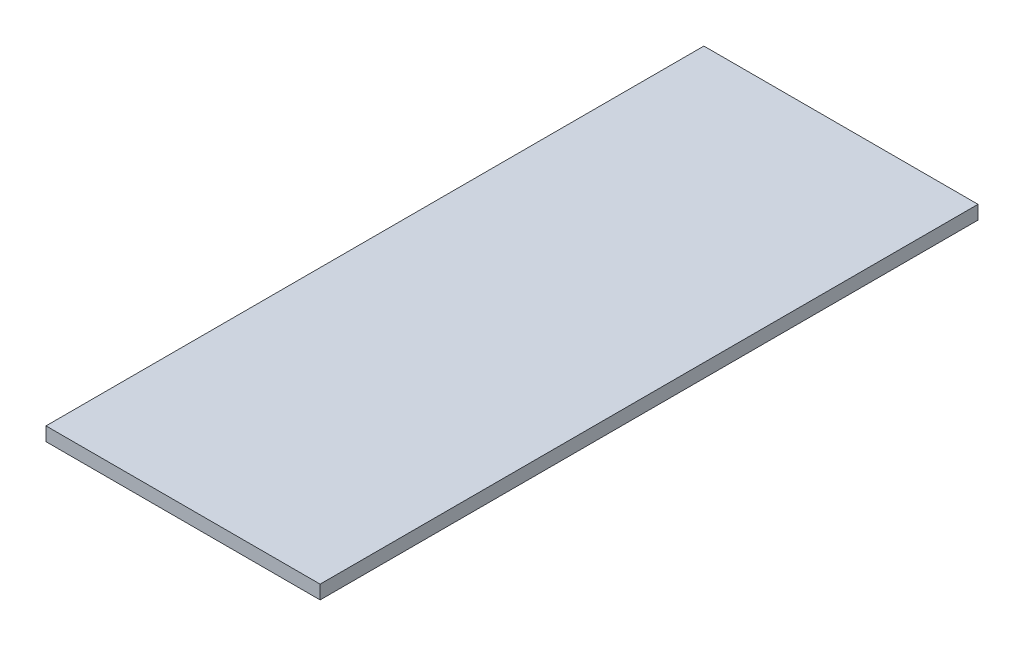
ISO-10303-21;
HEADER;
FILE_DESCRIPTION(('STEP AP214'),'2;1');
FILE_NAME('part.step','',(''),(''),'','','');
FILE_SCHEMA(('AUTOMOTIVE_DESIGN { 1 0 10303 214 1 1 1 1 }'));
ENDSEC;
DATA;
#1=APPLICATION_CONTEXT('core data for automotive mechanical design processes');
#2=APPLICATION_PROTOCOL_DEFINITION('international standard','automotive_design',2000,#1);
#3=PRODUCT_CONTEXT('',#1,'mechanical');
#4=PRODUCT('Part','Part','',(#3));
#5=PRODUCT_RELATED_PRODUCT_CATEGORY('part','',(#4));
#6=PRODUCT_DEFINITION_FORMATION('','',#4);
#7=PRODUCT_DEFINITION_CONTEXT('part definition',#1,'design');
#8=PRODUCT_DEFINITION('design','',#6,#7);
#9=PRODUCT_DEFINITION_SHAPE('','',#8);
#10=(LENGTH_UNIT() NAMED_UNIT(*) SI_UNIT(.MILLI.,.METRE.));
#11=(NAMED_UNIT(*) PLANE_ANGLE_UNIT() SI_UNIT($,.RADIAN.));
#12=(NAMED_UNIT(*) SI_UNIT($,.STERADIAN.) SOLID_ANGLE_UNIT());
#13=UNCERTAINTY_MEASURE_WITH_UNIT(LENGTH_MEASURE(1.E-05),#10,'distance_accuracy_value','');
#14=(GEOMETRIC_REPRESENTATION_CONTEXT(3) GLOBAL_UNCERTAINTY_ASSIGNED_CONTEXT((#13)) GLOBAL_UNIT_ASSIGNED_CONTEXT((#10,
#11,#12)) REPRESENTATION_CONTEXT('',''));
#15=CARTESIAN_POINT('',(0.,0.,0.));
#16=DIRECTION('',(0.,0.,1.));
#17=DIRECTION('',(1.,0.,0.));
#18=AXIS2_PLACEMENT_3D('',#15,#16,#17);
#19=CARTESIAN_POINT('',(0.,12.7,-609.6));
#20=DIRECTION('',(0.,0.,-1.));
#21=DIRECTION('',(-1.,0.,0.));
#22=AXIS2_PLACEMENT_3D('',#19,#20,#21);
#23=PLANE('',#22);
#24=DIRECTION('',(1.,0.,0.));
#25=VECTOR('',#24,1.);
#26=CARTESIAN_POINT('',(0.,0.,-609.6));
#27=LINE('',#26,#25);
#28=CARTESIAN_POINT('',(0.,0.,-609.6));
#29=VERTEX_POINT('',#28);
#30=CARTESIAN_POINT('',(254.,0.,-609.6));
#31=VERTEX_POINT('',#30);
#32=EDGE_CURVE('E97',#29,#31,#27,.T.);
#33=ORIENTED_EDGE('',*,*,#32,.F.);
#34=DIRECTION('',(0.,-1.,0.));
#35=VECTOR('',#34,1.);
#36=CARTESIAN_POINT('',(0.,12.7,-609.6));
#37=LINE('',#36,#35);
#38=CARTESIAN_POINT('',(0.,12.7,-609.6));
#39=VERTEX_POINT('',#38);
#40=EDGE_CURVE('E11',#39,#29,#37,.T.);
#41=ORIENTED_EDGE('',*,*,#40,.F.);
#42=DIRECTION('',(1.,0.,0.));
#43=VECTOR('',#42,1.);
#44=CARTESIAN_POINT('',(0.,12.7,-609.6));
#45=LINE('',#44,#43);
#46=CARTESIAN_POINT('',(254.,12.7,-609.6));
#47=VERTEX_POINT('',#46);
#48=EDGE_CURVE('E91',#39,#47,#45,.T.);
#49=ORIENTED_EDGE('',*,*,#48,.T.);
#50=DIRECTION('',(0.,-1.,0.));
#51=VECTOR('',#50,1.);
#52=CARTESIAN_POINT('',(254.,12.7,-609.6));
#53=LINE('',#52,#51);
#54=EDGE_CURVE('E36',#47,#31,#53,.T.);
#55=ORIENTED_EDGE('',*,*,#54,.T.);
#56=EDGE_LOOP('',(#33,#41,#49,#55));
#57=FACE_BOUND('',#56,.T.);
#58=ADVANCED_FACE('F33',(#57),#23,.T.);
#59=CARTESIAN_POINT('',(0.,12.7,0.));
#60=DIRECTION('',(-1.,0.,0.));
#61=DIRECTION('',(0.,0.,1.));
#62=AXIS2_PLACEMENT_3D('',#59,#60,#61);
#63=PLANE('',#62);
#64=DIRECTION('',(0.,0.,-1.));
#65=VECTOR('',#64,1.);
#66=CARTESIAN_POINT('',(0.,0.,0.));
#67=LINE('',#66,#65);
#68=CARTESIAN_POINT('',(0.,0.,0.));
#69=VERTEX_POINT('',#68);
#70=EDGE_CURVE('E93',#69,#29,#67,.T.);
#71=ORIENTED_EDGE('',*,*,#70,.F.);
#72=DIRECTION('',(0.,-1.,0.));
#73=VECTOR('',#72,1.);
#74=CARTESIAN_POINT('',(0.,12.7,0.));
#75=LINE('',#74,#73);
#76=CARTESIAN_POINT('',(0.,12.7,0.));
#77=VERTEX_POINT('',#76);
#78=EDGE_CURVE('E42',#77,#69,#75,.T.);
#79=ORIENTED_EDGE('',*,*,#78,.F.);
#80=DIRECTION('',(0.,0.,-1.));
#81=VECTOR('',#80,1.);
#82=CARTESIAN_POINT('',(0.,12.7,0.));
#83=LINE('',#82,#81);
#84=EDGE_CURVE('E81',#77,#39,#83,.T.);
#85=ORIENTED_EDGE('',*,*,#84,.T.);
#86=ORIENTED_EDGE('',*,*,#40,.T.);
#87=EDGE_LOOP('',(#71,#79,#85,#86));
#88=FACE_BOUND('',#87,.T.);
#89=ADVANCED_FACE('F107',(#88),#63,.T.);
#90=CARTESIAN_POINT('',(0.,12.7,0.));
#91=DIRECTION('',(0.,0.,-1.));
#92=DIRECTION('',(-1.,0.,0.));
#93=AXIS2_PLACEMENT_3D('',#90,#91,#92);
#94=PLANE('',#93);
#95=DIRECTION('',(1.,0.,0.));
#96=VECTOR('',#95,1.);
#97=CARTESIAN_POINT('',(0.,0.,0.));
#98=LINE('',#97,#96);
#99=CARTESIAN_POINT('',(254.,0.,0.));
#100=VERTEX_POINT('',#99);
#101=EDGE_CURVE('E86',#69,#100,#98,.T.);
#102=ORIENTED_EDGE('',*,*,#101,.T.);
#103=DIRECTION('',(0.,-1.,0.));
#104=VECTOR('',#103,1.);
#105=CARTESIAN_POINT('',(254.,12.7,0.));
#106=LINE('',#105,#104);
#107=CARTESIAN_POINT('',(254.,12.7,0.));
#108=VERTEX_POINT('',#107);
#109=EDGE_CURVE('E84',#108,#100,#106,.T.);
#110=ORIENTED_EDGE('',*,*,#109,.F.);
#111=DIRECTION('',(1.,0.,0.));
#112=VECTOR('',#111,1.);
#113=CARTESIAN_POINT('',(0.,12.7,0.));
#114=LINE('',#113,#112);
#115=EDGE_CURVE('E78',#77,#108,#114,.T.);
#116=ORIENTED_EDGE('',*,*,#115,.F.);
#117=ORIENTED_EDGE('',*,*,#78,.T.);
#118=EDGE_LOOP('',(#102,#110,#116,#117));
#119=FACE_BOUND('',#118,.T.);
#120=ADVANCED_FACE('F85',(#119),#94,.F.);
#121=CARTESIAN_POINT('',(254.,12.7,0.));
#122=DIRECTION('',(-1.,0.,0.));
#123=DIRECTION('',(0.,0.,1.));
#124=AXIS2_PLACEMENT_3D('',#121,#122,#123);
#125=PLANE('',#124);
#126=DIRECTION('',(0.,0.,-1.));
#127=VECTOR('',#126,1.);
#128=CARTESIAN_POINT('',(254.,0.,0.));
#129=LINE('',#128,#127);
#130=EDGE_CURVE('E100',#100,#31,#129,.T.);
#131=ORIENTED_EDGE('',*,*,#130,.T.);
#132=ORIENTED_EDGE('',*,*,#54,.F.);
#133=DIRECTION('',(0.,0.,-1.));
#134=VECTOR('',#133,1.);
#135=CARTESIAN_POINT('',(254.,12.7,0.));
#136=LINE('',#135,#134);
#137=EDGE_CURVE('E75',#108,#47,#136,.T.);
#138=ORIENTED_EDGE('',*,*,#137,.F.);
#139=ORIENTED_EDGE('',*,*,#109,.T.);
#140=EDGE_LOOP('',(#131,#132,#138,#139));
#141=FACE_BOUND('',#140,.T.);
#142=ADVANCED_FACE('F90',(#141),#125,.F.);
#143=CARTESIAN_POINT('',(0.,12.7,0.));
#144=DIRECTION('',(0.,1.,0.));
#145=DIRECTION('',(0.,0.,1.));
#146=AXIS2_PLACEMENT_3D('',#143,#144,#145);
#147=PLANE('',#146);
#148=ORIENTED_EDGE('',*,*,#48,.F.);
#149=ORIENTED_EDGE('',*,*,#84,.F.);
#150=ORIENTED_EDGE('',*,*,#115,.T.);
#151=ORIENTED_EDGE('',*,*,#137,.T.);
#152=EDGE_LOOP('',(#148,#149,#150,#151));
#153=FACE_BOUND('',#152,.T.);
#154=ADVANCED_FACE('F80',(#153),#147,.T.);
#155=CARTESIAN_POINT('',(0.,0.,0.));
#156=DIRECTION('',(0.,1.,0.));
#157=DIRECTION('',(0.,0.,1.));
#158=AXIS2_PLACEMENT_3D('',#155,#156,#157);
#159=PLANE('',#158);
#160=ORIENTED_EDGE('',*,*,#32,.T.);
#161=ORIENTED_EDGE('',*,*,#130,.F.);
#162=ORIENTED_EDGE('',*,*,#101,.F.);
#163=ORIENTED_EDGE('',*,*,#70,.T.);
#164=EDGE_LOOP('',(#160,#161,#162,#163));
#165=FACE_BOUND('',#164,.T.);
#166=ADVANCED_FACE('F106',(#165),#159,.F.);
#167=CLOSED_SHELL('',(#58,#89,#120,#142,#154,#166));
#168=MANIFOLD_SOLID_BREP('B2',#167);
#169=ADVANCED_BREP_SHAPE_REPRESENTATION('',(#18,#168),#14);
#170=SHAPE_DEFINITION_REPRESENTATION(#9,#169);
ENDSEC;
END-ISO-10303-21;
